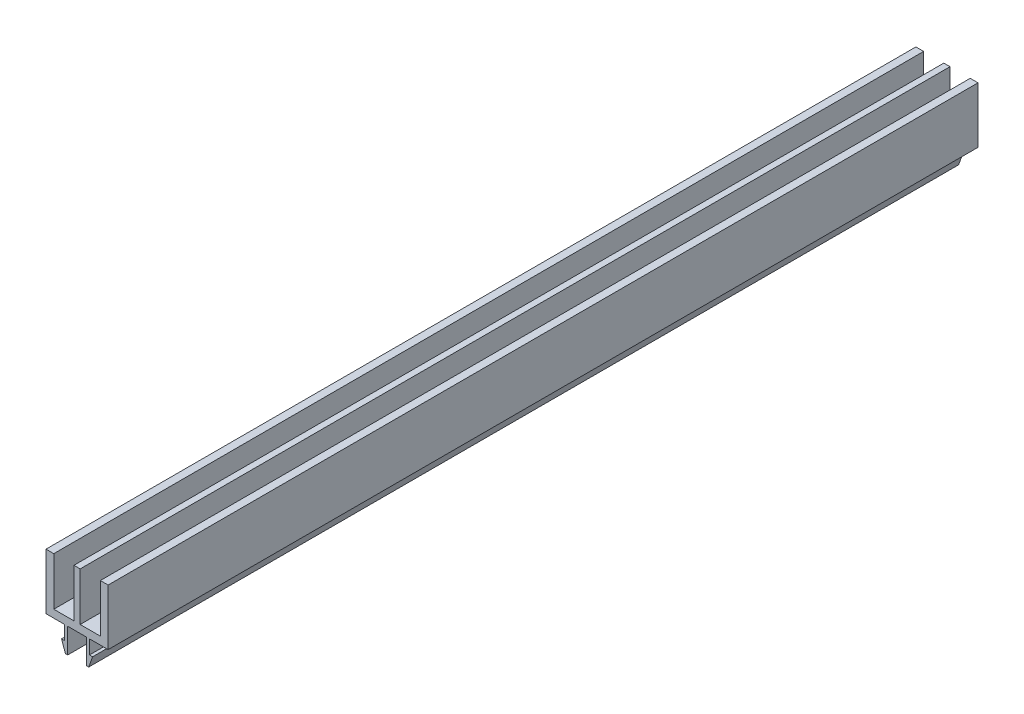
ISO-10303-21;
HEADER;
FILE_DESCRIPTION(('STEP AP214'),'2;1');
FILE_NAME('part.step','',(''),(''),'','','');
FILE_SCHEMA(('AUTOMOTIVE_DESIGN { 1 0 10303 214 1 1 1 1 }'));
ENDSEC;
DATA;
#1=APPLICATION_CONTEXT('core data for automotive mechanical design processes');
#2=APPLICATION_PROTOCOL_DEFINITION('international standard','automotive_design',2000,#1);
#3=PRODUCT_CONTEXT('',#1,'mechanical');
#4=PRODUCT('Part','Part','',(#3));
#5=PRODUCT_RELATED_PRODUCT_CATEGORY('part','',(#4));
#6=PRODUCT_DEFINITION_FORMATION('','',#4);
#7=PRODUCT_DEFINITION_CONTEXT('part definition',#1,'design');
#8=PRODUCT_DEFINITION('design','',#6,#7);
#9=PRODUCT_DEFINITION_SHAPE('','',#8);
#10=(LENGTH_UNIT() NAMED_UNIT(*) SI_UNIT(.MILLI.,.METRE.));
#11=(NAMED_UNIT(*) PLANE_ANGLE_UNIT() SI_UNIT($,.RADIAN.));
#12=(NAMED_UNIT(*) SI_UNIT($,.STERADIAN.) SOLID_ANGLE_UNIT());
#13=UNCERTAINTY_MEASURE_WITH_UNIT(LENGTH_MEASURE(1.E-05),#10,'distance_accuracy_value','');
#14=(GEOMETRIC_REPRESENTATION_CONTEXT(3) GLOBAL_UNCERTAINTY_ASSIGNED_CONTEXT((#13)) GLOBAL_UNIT_ASSIGNED_CONTEXT((#10,
#11,#12)) REPRESENTATION_CONTEXT('',''));
#15=CARTESIAN_POINT('',(0.,0.,0.));
#16=DIRECTION('',(0.,0.,1.));
#17=DIRECTION('',(1.,0.,0.));
#18=AXIS2_PLACEMENT_3D('',#15,#16,#17);
#19=CARTESIAN_POINT('',(-1.,17.9999999975,-230.));
#20=DIRECTION('',(-1.,0.,0.));
#21=DIRECTION('',(0.,-1.,0.));
#22=AXIS2_PLACEMENT_3D('',#19,#20,#21);
#23=PLANE('',#22);
#24=DIRECTION('',(0.,-1.,0.));
#25=VECTOR('',#24,1.);
#26=CARTESIAN_POINT('',(-1.,17.9999999975,50.));
#27=LINE('',#26,#25);
#28=CARTESIAN_POINT('',(-1.,17.9999999975,50.));
#29=VERTEX_POINT('',#28);
#30=CARTESIAN_POINT('',(-1.,2.4999999995,50.));
#31=VERTEX_POINT('',#30);
#32=EDGE_CURVE('E226',#29,#31,#27,.T.);
#33=ORIENTED_EDGE('',*,*,#32,.F.);
#34=DIRECTION('',(0.,0.,1.));
#35=VECTOR('',#34,1.);
#36=CARTESIAN_POINT('',(-1.,17.9999999975,-230.));
#37=LINE('',#36,#35);
#38=CARTESIAN_POINT('',(-1.,17.9999999975,-230.));
#39=VERTEX_POINT('',#38);
#40=EDGE_CURVE('E11',#39,#29,#37,.T.);
#41=ORIENTED_EDGE('',*,*,#40,.F.);
#42=DIRECTION('',(0.,-1.,0.));
#43=VECTOR('',#42,1.);
#44=CARTESIAN_POINT('',(-1.,17.9999999975,-230.));
#45=LINE('',#44,#43);
#46=CARTESIAN_POINT('',(-1.,2.4999999995,-230.));
#47=VERTEX_POINT('',#46);
#48=EDGE_CURVE('E294',#39,#47,#45,.T.);
#49=ORIENTED_EDGE('',*,*,#48,.T.);
#50=DIRECTION('',(0.,0.,1.));
#51=VECTOR('',#50,1.);
#52=CARTESIAN_POINT('',(-1.,2.4999999995,-230.));
#53=LINE('',#52,#51);
#54=EDGE_CURVE('E36',#47,#31,#53,.T.);
#55=ORIENTED_EDGE('',*,*,#54,.T.);
#56=EDGE_LOOP('',(#33,#41,#49,#55));
#57=FACE_BOUND('',#56,.T.);
#58=ADVANCED_FACE('F33',(#57),#23,.T.);
#59=CARTESIAN_POINT('',(0.999999999999998,17.9999999975,-230.));
#60=DIRECTION('',(0.,1.,0.));
#61=DIRECTION('',(0.,0.,1.));
#62=AXIS2_PLACEMENT_3D('',#59,#60,#61);
#63=PLANE('',#62);
#64=DIRECTION('',(-1.,0.,0.));
#65=VECTOR('',#64,1.);
#66=CARTESIAN_POINT('',(0.999999999999998,17.9999999975,50.));
#67=LINE('',#66,#65);
#68=CARTESIAN_POINT('',(0.999999999999998,17.9999999975,50.));
#69=VERTEX_POINT('',#68);
#70=EDGE_CURVE('E292',#69,#29,#67,.T.);
#71=ORIENTED_EDGE('',*,*,#70,.F.);
#72=DIRECTION('',(0.,0.,1.));
#73=VECTOR('',#72,1.);
#74=CARTESIAN_POINT('',(0.999999999999998,17.9999999975,-230.));
#75=LINE('',#74,#73);
#76=CARTESIAN_POINT('',(0.999999999999998,17.9999999975,-230.));
#77=VERTEX_POINT('',#76);
#78=EDGE_CURVE('E42',#77,#69,#75,.T.);
#79=ORIENTED_EDGE('',*,*,#78,.F.);
#80=DIRECTION('',(-1.,0.,0.));
#81=VECTOR('',#80,1.);
#82=CARTESIAN_POINT('',(0.999999999999998,17.9999999975,-230.));
#83=LINE('',#82,#81);
#84=EDGE_CURVE('E216',#77,#39,#83,.T.);
#85=ORIENTED_EDGE('',*,*,#84,.T.);
#86=ORIENTED_EDGE('',*,*,#40,.T.);
#87=EDGE_LOOP('',(#71,#79,#85,#86));
#88=FACE_BOUND('',#87,.T.);
#89=ADVANCED_FACE('F338',(#88),#63,.T.);
#90=CARTESIAN_POINT('',(0.999999999999998,2.4999999995,-230.));
#91=DIRECTION('',(1.,0.,0.));
#92=DIRECTION('',(0.,0.,-1.));
#93=AXIS2_PLACEMENT_3D('',#90,#91,#92);
#94=PLANE('',#93);
#95=DIRECTION('',(0.,1.,0.));
#96=VECTOR('',#95,1.);
#97=CARTESIAN_POINT('',(0.999999999999998,2.4999999995,50.));
#98=LINE('',#97,#96);
#99=CARTESIAN_POINT('',(0.999999999999998,2.4999999995,50.));
#100=VERTEX_POINT('',#99);
#101=EDGE_CURVE('E203',#100,#69,#98,.T.);
#102=ORIENTED_EDGE('',*,*,#101,.F.);
#103=DIRECTION('',(0.,0.,1.));
#104=VECTOR('',#103,1.);
#105=CARTESIAN_POINT('',(0.999999999999998,2.4999999995,-230.));
#106=LINE('',#105,#104);
#107=CARTESIAN_POINT('',(0.999999999999998,2.4999999995,-230.));
#108=VERTEX_POINT('',#107);
#109=EDGE_CURVE('E198',#108,#100,#106,.T.);
#110=ORIENTED_EDGE('',*,*,#109,.F.);
#111=DIRECTION('',(0.,1.,0.));
#112=VECTOR('',#111,1.);
#113=CARTESIAN_POINT('',(0.999999999999998,2.4999999995,-230.));
#114=LINE('',#113,#112);
#115=EDGE_CURVE('E201',#108,#77,#114,.T.);
#116=ORIENTED_EDGE('',*,*,#115,.T.);
#117=ORIENTED_EDGE('',*,*,#78,.T.);
#118=EDGE_LOOP('',(#102,#110,#116,#117));
#119=FACE_BOUND('',#118,.T.);
#120=ADVANCED_FACE('F200',(#119),#94,.T.);
#121=CARTESIAN_POINT('',(7.5,2.4999999995,-230.));
#122=DIRECTION('',(0.,1.,0.));
#123=DIRECTION('',(-1.,0.,0.));
#124=AXIS2_PLACEMENT_3D('',#121,#122,#123);
#125=PLANE('',#124);
#126=DIRECTION('',(-1.,0.,0.));
#127=VECTOR('',#126,1.);
#128=CARTESIAN_POINT('',(7.5,2.4999999995,50.));
#129=LINE('',#128,#127);
#130=CARTESIAN_POINT('',(7.5,2.4999999995,50.));
#131=VERTEX_POINT('',#130);
#132=EDGE_CURVE('E289',#131,#100,#129,.T.);
#133=ORIENTED_EDGE('',*,*,#132,.F.);
#134=DIRECTION('',(0.,0.,1.));
#135=VECTOR('',#134,1.);
#136=CARTESIAN_POINT('',(7.5,2.4999999995,-230.));
#137=LINE('',#136,#135);
#138=CARTESIAN_POINT('',(7.5,2.4999999995,-230.));
#139=VERTEX_POINT('',#138);
#140=EDGE_CURVE('E208',#139,#131,#137,.T.);
#141=ORIENTED_EDGE('',*,*,#140,.F.);
#142=DIRECTION('',(-1.,0.,0.));
#143=VECTOR('',#142,1.);
#144=CARTESIAN_POINT('',(7.5,2.4999999995,-230.));
#145=LINE('',#144,#143);
#146=EDGE_CURVE('E214',#139,#108,#145,.T.);
#147=ORIENTED_EDGE('',*,*,#146,.T.);
#148=ORIENTED_EDGE('',*,*,#109,.T.);
#149=EDGE_LOOP('',(#133,#141,#147,#148));
#150=FACE_BOUND('',#149,.T.);
#151=ADVANCED_FACE('F218',(#150),#125,.T.);
#152=CARTESIAN_POINT('',(7.5,17.9999999975,-230.));
#153=DIRECTION('',(-1.,0.,0.));
#154=DIRECTION('',(0.,-1.,0.));
#155=AXIS2_PLACEMENT_3D('',#152,#153,#154);
#156=PLANE('',#155);
#157=DIRECTION('',(0.,-1.,0.));
#158=VECTOR('',#157,1.);
#159=CARTESIAN_POINT('',(7.5,17.9999999975,50.));
#160=LINE('',#159,#158);
#161=CARTESIAN_POINT('',(7.5,17.9999999975,50.));
#162=VERTEX_POINT('',#161);
#163=EDGE_CURVE('E286',#162,#131,#160,.T.);
#164=ORIENTED_EDGE('',*,*,#163,.F.);
#165=DIRECTION('',(0.,0.,1.));
#166=VECTOR('',#165,1.);
#167=CARTESIAN_POINT('',(7.5,17.9999999975,-230.));
#168=LINE('',#167,#166);
#169=CARTESIAN_POINT('',(7.5,17.9999999975,-230.));
#170=VERTEX_POINT('',#169);
#171=EDGE_CURVE('E298',#170,#162,#168,.T.);
#172=ORIENTED_EDGE('',*,*,#171,.F.);
#173=DIRECTION('',(0.,-1.,0.));
#174=VECTOR('',#173,1.);
#175=CARTESIAN_POINT('',(7.5,17.9999999975,-230.));
#176=LINE('',#175,#174);
#177=EDGE_CURVE('E219',#170,#139,#176,.T.);
#178=ORIENTED_EDGE('',*,*,#177,.T.);
#179=ORIENTED_EDGE('',*,*,#140,.T.);
#180=EDGE_LOOP('',(#164,#172,#178,#179));
#181=FACE_BOUND('',#180,.T.);
#182=ADVANCED_FACE('F351',(#181),#156,.T.);
#183=CARTESIAN_POINT('',(10.,17.9999999975,-230.));
#184=DIRECTION('',(0.,1.,0.));
#185=DIRECTION('',(0.,0.,1.));
#186=AXIS2_PLACEMENT_3D('',#183,#184,#185);
#187=PLANE('',#186);
#188=DIRECTION('',(-1.,0.,0.));
#189=VECTOR('',#188,1.);
#190=CARTESIAN_POINT('',(10.,17.9999999975,50.));
#191=LINE('',#190,#189);
#192=CARTESIAN_POINT('',(10.,17.9999999975,50.));
#193=VERTEX_POINT('',#192);
#194=EDGE_CURVE('E283',#193,#162,#191,.T.);
#195=ORIENTED_EDGE('',*,*,#194,.F.);
#196=DIRECTION('',(0.,0.,1.));
#197=VECTOR('',#196,1.);
#198=CARTESIAN_POINT('',(10.,17.9999999975,-230.));
#199=LINE('',#198,#197);
#200=CARTESIAN_POINT('',(10.,17.9999999975,-230.));
#201=VERTEX_POINT('',#200);
#202=EDGE_CURVE('E300',#201,#193,#199,.T.);
#203=ORIENTED_EDGE('',*,*,#202,.F.);
#204=DIRECTION('',(-1.,0.,0.));
#205=VECTOR('',#204,1.);
#206=CARTESIAN_POINT('',(10.,17.9999999975,-230.));
#207=LINE('',#206,#205);
#208=EDGE_CURVE('E221',#201,#170,#207,.T.);
#209=ORIENTED_EDGE('',*,*,#208,.T.);
#210=ORIENTED_EDGE('',*,*,#171,.T.);
#211=EDGE_LOOP('',(#195,#203,#209,#210));
#212=FACE_BOUND('',#211,.T.);
#213=ADVANCED_FACE('F354',(#212),#187,.T.);
#214=CARTESIAN_POINT('',(10.,-4.99999828349541E-10,-230.));
#215=DIRECTION('',(1.,0.,0.));
#216=DIRECTION('',(0.,0.,-1.));
#217=AXIS2_PLACEMENT_3D('',#214,#215,#216);
#218=PLANE('',#217);
#219=DIRECTION('',(0.,1.,0.));
#220=VECTOR('',#219,1.);
#221=CARTESIAN_POINT('',(10.,-4.99999828349541E-10,50.));
#222=LINE('',#221,#220);
#223=CARTESIAN_POINT('',(10.,-4.99999828349541E-10,50.));
#224=VERTEX_POINT('',#223);
#225=EDGE_CURVE('E280',#224,#193,#222,.T.);
#226=ORIENTED_EDGE('',*,*,#225,.F.);
#227=DIRECTION('',(0.,0.,1.));
#228=VECTOR('',#227,1.);
#229=CARTESIAN_POINT('',(10.,-4.99999828349541E-10,-230.));
#230=LINE('',#229,#228);
#231=CARTESIAN_POINT('',(10.,-4.99999828349541E-10,-230.));
#232=VERTEX_POINT('',#231);
#233=EDGE_CURVE('E302',#232,#224,#230,.T.);
#234=ORIENTED_EDGE('',*,*,#233,.F.);
#235=DIRECTION('',(0.,1.,0.));
#236=VECTOR('',#235,1.);
#237=CARTESIAN_POINT('',(10.,-4.99999828349541E-10,-230.));
#238=LINE('',#237,#236);
#239=EDGE_CURVE('E644',#232,#201,#238,.T.);
#240=ORIENTED_EDGE('',*,*,#239,.T.);
#241=ORIENTED_EDGE('',*,*,#202,.T.);
#242=EDGE_LOOP('',(#226,#234,#240,#241));
#243=FACE_BOUND('',#242,.T.);
#244=ADVANCED_FACE('F358',(#243),#218,.T.);
#245=CARTESIAN_POINT('',(4.,-4.99999998002099E-10,-230.));
#246=DIRECTION('',(0.,-1.,0.));
#247=DIRECTION('',(1.,0.,0.));
#248=AXIS2_PLACEMENT_3D('',#245,#246,#247);
#249=PLANE('',#248);
#250=DIRECTION('',(1.,0.,0.));
#251=VECTOR('',#250,1.);
#252=CARTESIAN_POINT('',(4.,-4.99999998002099E-10,50.));
#253=LINE('',#252,#251);
#254=CARTESIAN_POINT('',(4.,-4.99999998002099E-10,50.));
#255=VERTEX_POINT('',#254);
#256=EDGE_CURVE('E277',#255,#224,#253,.T.);
#257=ORIENTED_EDGE('',*,*,#256,.F.);
#258=DIRECTION('',(0.,0.,1.));
#259=VECTOR('',#258,1.);
#260=CARTESIAN_POINT('',(4.,-4.99999998002099E-10,-230.));
#261=LINE('',#260,#259);
#262=CARTESIAN_POINT('',(4.,-4.99999998002099E-10,-230.));
#263=VERTEX_POINT('',#262);
#264=EDGE_CURVE('E304',#263,#255,#261,.T.);
#265=ORIENTED_EDGE('',*,*,#264,.F.);
#266=DIRECTION('',(1.,0.,0.));
#267=VECTOR('',#266,1.);
#268=CARTESIAN_POINT('',(4.,-4.99999998002099E-10,-230.));
#269=LINE('',#268,#267);
#270=EDGE_CURVE('E648',#263,#232,#269,.T.);
#271=ORIENTED_EDGE('',*,*,#270,.T.);
#272=ORIENTED_EDGE('',*,*,#233,.T.);
#273=EDGE_LOOP('',(#257,#265,#271,#272));
#274=FACE_BOUND('',#273,.T.);
#275=ADVANCED_FACE('F362',(#274),#249,.T.);
#276=CARTESIAN_POINT('',(4.,-4.5,-230.));
#277=DIRECTION('',(1.,0.,0.));
#278=DIRECTION('',(0.,0.,-1.));
#279=AXIS2_PLACEMENT_3D('',#276,#277,#278);
#280=PLANE('',#279);
#281=DIRECTION('',(0.,1.,0.));
#282=VECTOR('',#281,1.);
#283=CARTESIAN_POINT('',(4.,-4.5,50.));
#284=LINE('',#283,#282);
#285=CARTESIAN_POINT('',(4.,-4.5,50.));
#286=VERTEX_POINT('',#285);
#287=EDGE_CURVE('E274',#286,#255,#284,.T.);
#288=ORIENTED_EDGE('',*,*,#287,.F.);
#289=DIRECTION('',(0.,0.,1.));
#290=VECTOR('',#289,1.);
#291=CARTESIAN_POINT('',(4.,-4.5,-230.));
#292=LINE('',#291,#290);
#293=CARTESIAN_POINT('',(4.,-4.5,-230.));
#294=VERTEX_POINT('',#293);
#295=EDGE_CURVE('E306',#294,#286,#292,.T.);
#296=ORIENTED_EDGE('',*,*,#295,.F.);
#297=DIRECTION('',(0.,1.,0.));
#298=VECTOR('',#297,1.);
#299=CARTESIAN_POINT('',(4.,-4.5,-230.));
#300=LINE('',#299,#298);
#301=EDGE_CURVE('E637',#294,#263,#300,.T.);
#302=ORIENTED_EDGE('',*,*,#301,.T.);
#303=ORIENTED_EDGE('',*,*,#264,.T.);
#304=EDGE_LOOP('',(#288,#296,#302,#303));
#305=FACE_BOUND('',#304,.T.);
#306=ADVANCED_FACE('F366',(#305),#280,.T.);
#307=CARTESIAN_POINT('',(5.,-4.5,-230.));
#308=DIRECTION('',(0.,1.,0.));
#309=DIRECTION('',(0.,0.,1.));
#310=AXIS2_PLACEMENT_3D('',#307,#308,#309);
#311=PLANE('',#310);
#312=DIRECTION('',(-1.,0.,0.));
#313=VECTOR('',#312,1.);
#314=CARTESIAN_POINT('',(5.,-4.5,50.));
#315=LINE('',#314,#313);
#316=CARTESIAN_POINT('',(5.,-4.5,50.));
#317=VERTEX_POINT('',#316);
#318=EDGE_CURVE('E271',#317,#286,#315,.T.);
#319=ORIENTED_EDGE('',*,*,#318,.F.);
#320=DIRECTION('',(0.,0.,1.));
#321=VECTOR('',#320,1.);
#322=CARTESIAN_POINT('',(5.,-4.5,-230.));
#323=LINE('',#322,#321);
#324=CARTESIAN_POINT('',(5.,-4.5,-230.));
#325=VERTEX_POINT('',#324);
#326=EDGE_CURVE('E308',#325,#317,#323,.T.);
#327=ORIENTED_EDGE('',*,*,#326,.F.);
#328=DIRECTION('',(-1.,0.,0.));
#329=VECTOR('',#328,1.);
#330=CARTESIAN_POINT('',(5.,-4.5,-230.));
#331=LINE('',#330,#329);
#332=EDGE_CURVE('E633',#325,#294,#331,.T.);
#333=ORIENTED_EDGE('',*,*,#332,.T.);
#334=ORIENTED_EDGE('',*,*,#295,.T.);
#335=EDGE_LOOP('',(#319,#327,#333,#334));
#336=FACE_BOUND('',#335,.T.);
#337=ADVANCED_FACE('F370',(#336),#311,.T.);
#338=CARTESIAN_POINT('',(3.75,-8.,-230.));
#339=DIRECTION('',(0.941741911594837,-0.336336396998156,0.));
#340=DIRECTION('',(0.336336396998156,0.941741911594838,0.));
#341=AXIS2_PLACEMENT_3D('',#338,#339,#340);
#342=PLANE('',#341);
#343=DIRECTION('',(0.336336396998157,0.941741911594837,0.));
#344=VECTOR('',#343,1.);
#345=CARTESIAN_POINT('',(3.75,-8.,50.));
#346=LINE('',#345,#344);
#347=CARTESIAN_POINT('',(3.75,-8.,50.));
#348=VERTEX_POINT('',#347);
#349=EDGE_CURVE('E268',#348,#317,#346,.T.);
#350=ORIENTED_EDGE('',*,*,#349,.F.);
#351=DIRECTION('',(0.,0.,1.));
#352=VECTOR('',#351,1.);
#353=CARTESIAN_POINT('',(3.75,-8.,-230.));
#354=LINE('',#353,#352);
#355=CARTESIAN_POINT('',(3.75,-8.,-230.));
#356=VERTEX_POINT('',#355);
#357=EDGE_CURVE('E310',#356,#348,#354,.T.);
#358=ORIENTED_EDGE('',*,*,#357,.F.);
#359=DIRECTION('',(0.336336396998157,0.941741911594837,0.));
#360=VECTOR('',#359,1.);
#361=CARTESIAN_POINT('',(3.75,-8.,-230.));
#362=LINE('',#361,#360);
#363=EDGE_CURVE('E654',#356,#325,#362,.T.);
#364=ORIENTED_EDGE('',*,*,#363,.T.);
#365=ORIENTED_EDGE('',*,*,#326,.T.);
#366=EDGE_LOOP('',(#350,#358,#364,#365));
#367=FACE_BOUND('',#366,.T.);
#368=ADVANCED_FACE('F374',(#367),#342,.T.);
#369=CARTESIAN_POINT('',(3.,-8.,-230.));
#370=DIRECTION('',(0.,-1.,0.));
#371=DIRECTION('',(0.,0.,-1.));
#372=AXIS2_PLACEMENT_3D('',#369,#370,#371);
#373=PLANE('',#372);
#374=DIRECTION('',(1.,0.,0.));
#375=VECTOR('',#374,1.);
#376=CARTESIAN_POINT('',(3.,-8.,50.));
#377=LINE('',#376,#375);
#378=CARTESIAN_POINT('',(3.,-8.,50.));
#379=VERTEX_POINT('',#378);
#380=EDGE_CURVE('E265',#379,#348,#377,.T.);
#381=ORIENTED_EDGE('',*,*,#380,.F.);
#382=DIRECTION('',(0.,0.,1.));
#383=VECTOR('',#382,1.);
#384=CARTESIAN_POINT('',(3.,-8.,-230.));
#385=LINE('',#384,#383);
#386=CARTESIAN_POINT('',(3.,-8.,-230.));
#387=VERTEX_POINT('',#386);
#388=EDGE_CURVE('E312',#387,#379,#385,.T.);
#389=ORIENTED_EDGE('',*,*,#388,.F.);
#390=DIRECTION('',(1.,0.,0.));
#391=VECTOR('',#390,1.);
#392=CARTESIAN_POINT('',(3.,-8.,-230.));
#393=LINE('',#392,#391);
#394=EDGE_CURVE('E626',#387,#356,#393,.T.);
#395=ORIENTED_EDGE('',*,*,#394,.T.);
#396=ORIENTED_EDGE('',*,*,#357,.T.);
#397=EDGE_LOOP('',(#381,#389,#395,#396));
#398=FACE_BOUND('',#397,.T.);
#399=ADVANCED_FACE('F378',(#398),#373,.T.);
#400=CARTESIAN_POINT('',(3.,-4.9999985194348E-10,-230.));
#401=DIRECTION('',(-1.,0.,0.));
#402=DIRECTION('',(0.,0.,1.));
#403=AXIS2_PLACEMENT_3D('',#400,#401,#402);
#404=PLANE('',#403);
#405=DIRECTION('',(0.,-1.,0.));
#406=VECTOR('',#405,1.);
#407=CARTESIAN_POINT('',(3.,-4.9999985194348E-10,50.));
#408=LINE('',#407,#406);
#409=CARTESIAN_POINT('',(3.,-4.9999985194348E-10,50.));
#410=VERTEX_POINT('',#409);
#411=EDGE_CURVE('E262',#410,#379,#408,.T.);
#412=ORIENTED_EDGE('',*,*,#411,.F.);
#413=DIRECTION('',(0.,0.,1.));
#414=VECTOR('',#413,1.);
#415=CARTESIAN_POINT('',(3.,-4.9999985194348E-10,-230.));
#416=LINE('',#415,#414);
#417=CARTESIAN_POINT('',(3.,-4.9999985194348E-10,-230.));
#418=VERTEX_POINT('',#417);
#419=EDGE_CURVE('E314',#418,#410,#416,.T.);
#420=ORIENTED_EDGE('',*,*,#419,.F.);
#421=DIRECTION('',(0.,-1.,0.));
#422=VECTOR('',#421,1.);
#423=CARTESIAN_POINT('',(3.,-4.9999985194348E-10,-230.));
#424=LINE('',#423,#422);
#425=EDGE_CURVE('E622',#418,#387,#424,.T.);
#426=ORIENTED_EDGE('',*,*,#425,.T.);
#427=ORIENTED_EDGE('',*,*,#388,.T.);
#428=EDGE_LOOP('',(#412,#420,#426,#427));
#429=FACE_BOUND('',#428,.T.);
#430=ADVANCED_FACE('F382',(#429),#404,.T.);
#431=CARTESIAN_POINT('',(-3.,-4.99999455901012E-10,-230.));
#432=DIRECTION('',(0.,-1.,0.));
#433=DIRECTION('',(1.,0.,0.));
#434=AXIS2_PLACEMENT_3D('',#431,#432,#433);
#435=PLANE('',#434);
#436=DIRECTION('',(1.,0.,0.));
#437=VECTOR('',#436,1.);
#438=CARTESIAN_POINT('',(-3.,-4.99999455901012E-10,50.));
#439=LINE('',#438,#437);
#440=CARTESIAN_POINT('',(-3.,-4.99999455901012E-10,50.));
#441=VERTEX_POINT('',#440);
#442=EDGE_CURVE('E259',#441,#410,#439,.T.);
#443=ORIENTED_EDGE('',*,*,#442,.F.);
#444=DIRECTION('',(0.,0.,1.));
#445=VECTOR('',#444,1.);
#446=CARTESIAN_POINT('',(-3.,-4.99999455901012E-10,-230.));
#447=LINE('',#446,#445);
#448=CARTESIAN_POINT('',(-3.,-4.99999455901012E-10,-230.));
#449=VERTEX_POINT('',#448);
#450=EDGE_CURVE('E316',#449,#441,#447,.T.);
#451=ORIENTED_EDGE('',*,*,#450,.F.);
#452=DIRECTION('',(1.,0.,0.));
#453=VECTOR('',#452,1.);
#454=CARTESIAN_POINT('',(-3.,-4.99999455901012E-10,-230.));
#455=LINE('',#454,#453);
#456=EDGE_CURVE('E658',#449,#418,#455,.T.);
#457=ORIENTED_EDGE('',*,*,#456,.T.);
#458=ORIENTED_EDGE('',*,*,#419,.T.);
#459=EDGE_LOOP('',(#443,#451,#457,#458));
#460=FACE_BOUND('',#459,.T.);
#461=ADVANCED_FACE('F386',(#460),#435,.T.);
#462=CARTESIAN_POINT('',(-3.,-8.,-230.));
#463=DIRECTION('',(1.,0.,0.));
#464=DIRECTION('',(0.,0.,-1.));
#465=AXIS2_PLACEMENT_3D('',#462,#463,#464);
#466=PLANE('',#465);
#467=DIRECTION('',(0.,1.,0.));
#468=VECTOR('',#467,1.);
#469=CARTESIAN_POINT('',(-3.,-8.,50.));
#470=LINE('',#469,#468);
#471=CARTESIAN_POINT('',(-3.,-8.,50.));
#472=VERTEX_POINT('',#471);
#473=EDGE_CURVE('E256',#472,#441,#470,.T.);
#474=ORIENTED_EDGE('',*,*,#473,.F.);
#475=DIRECTION('',(0.,0.,1.));
#476=VECTOR('',#475,1.);
#477=CARTESIAN_POINT('',(-3.,-8.,-230.));
#478=LINE('',#477,#476);
#479=CARTESIAN_POINT('',(-3.,-8.,-230.));
#480=VERTEX_POINT('',#479);
#481=EDGE_CURVE('E318',#480,#472,#478,.T.);
#482=ORIENTED_EDGE('',*,*,#481,.F.);
#483=DIRECTION('',(0.,1.,0.));
#484=VECTOR('',#483,1.);
#485=CARTESIAN_POINT('',(-3.,-8.,-230.));
#486=LINE('',#485,#484);
#487=EDGE_CURVE('E615',#480,#449,#486,.T.);
#488=ORIENTED_EDGE('',*,*,#487,.T.);
#489=ORIENTED_EDGE('',*,*,#450,.T.);
#490=EDGE_LOOP('',(#474,#482,#488,#489));
#491=FACE_BOUND('',#490,.T.);
#492=ADVANCED_FACE('F390',(#491),#466,.T.);
#493=CARTESIAN_POINT('',(-3.75,-8.,-230.));
#494=DIRECTION('',(0.,-1.,0.));
#495=DIRECTION('',(0.,0.,-1.));
#496=AXIS2_PLACEMENT_3D('',#493,#494,#495);
#497=PLANE('',#496);
#498=DIRECTION('',(1.,0.,0.));
#499=VECTOR('',#498,1.);
#500=CARTESIAN_POINT('',(-3.75,-8.,50.));
#501=LINE('',#500,#499);
#502=CARTESIAN_POINT('',(-3.75,-8.,50.));
#503=VERTEX_POINT('',#502);
#504=EDGE_CURVE('E253',#503,#472,#501,.T.);
#505=ORIENTED_EDGE('',*,*,#504,.F.);
#506=DIRECTION('',(0.,0.,1.));
#507=VECTOR('',#506,1.);
#508=CARTESIAN_POINT('',(-3.75,-8.,-230.));
#509=LINE('',#508,#507);
#510=CARTESIAN_POINT('',(-3.75,-8.,-230.));
#511=VERTEX_POINT('',#510);
#512=EDGE_CURVE('E320',#511,#503,#509,.T.);
#513=ORIENTED_EDGE('',*,*,#512,.F.);
#514=DIRECTION('',(1.,0.,0.));
#515=VECTOR('',#514,1.);
#516=CARTESIAN_POINT('',(-3.75,-8.,-230.));
#517=LINE('',#516,#515);
#518=EDGE_CURVE('E611',#511,#480,#517,.T.);
#519=ORIENTED_EDGE('',*,*,#518,.T.);
#520=ORIENTED_EDGE('',*,*,#481,.T.);
#521=EDGE_LOOP('',(#505,#513,#519,#520));
#522=FACE_BOUND('',#521,.T.);
#523=ADVANCED_FACE('F394',(#522),#497,.T.);
#524=CARTESIAN_POINT('',(-5.,-4.5,-230.));
#525=DIRECTION('',(-0.941741911594837,-0.336336396998156,0.));
#526=DIRECTION('',(0.336336396998156,-0.941741911594838,0.));
#527=AXIS2_PLACEMENT_3D('',#524,#525,#526);
#528=PLANE('',#527);
#529=DIRECTION('',(0.336336396998156,-0.941741911594837,0.));
#530=VECTOR('',#529,1.);
#531=CARTESIAN_POINT('',(-5.,-4.5,50.));
#532=LINE('',#531,#530);
#533=CARTESIAN_POINT('',(-5.,-4.5,50.));
#534=VERTEX_POINT('',#533);
#535=EDGE_CURVE('E250',#534,#503,#532,.T.);
#536=ORIENTED_EDGE('',*,*,#535,.F.);
#537=DIRECTION('',(0.,0.,1.));
#538=VECTOR('',#537,1.);
#539=CARTESIAN_POINT('',(-5.,-4.5,-230.));
#540=LINE('',#539,#538);
#541=CARTESIAN_POINT('',(-5.,-4.5,-230.));
#542=VERTEX_POINT('',#541);
#543=EDGE_CURVE('E322',#542,#534,#540,.T.);
#544=ORIENTED_EDGE('',*,*,#543,.F.);
#545=DIRECTION('',(0.336336396998156,-0.941741911594837,0.));
#546=VECTOR('',#545,1.);
#547=CARTESIAN_POINT('',(-5.,-4.5,-230.));
#548=LINE('',#547,#546);
#549=EDGE_CURVE('E662',#542,#511,#548,.T.);
#550=ORIENTED_EDGE('',*,*,#549,.T.);
#551=ORIENTED_EDGE('',*,*,#512,.T.);
#552=EDGE_LOOP('',(#536,#544,#550,#551));
#553=FACE_BOUND('',#552,.T.);
#554=ADVANCED_FACE('F398',(#553),#528,.T.);
#555=CARTESIAN_POINT('',(-4.,-4.5,-230.));
#556=DIRECTION('',(0.,1.,0.));
#557=DIRECTION('',(0.,0.,1.));
#558=AXIS2_PLACEMENT_3D('',#555,#556,#557);
#559=PLANE('',#558);
#560=DIRECTION('',(-1.,0.,0.));
#561=VECTOR('',#560,1.);
#562=CARTESIAN_POINT('',(-4.,-4.5,50.));
#563=LINE('',#562,#561);
#564=CARTESIAN_POINT('',(-4.,-4.5,50.));
#565=VERTEX_POINT('',#564);
#566=EDGE_CURVE('E247',#565,#534,#563,.T.);
#567=ORIENTED_EDGE('',*,*,#566,.F.);
#568=DIRECTION('',(0.,0.,1.));
#569=VECTOR('',#568,1.);
#570=CARTESIAN_POINT('',(-4.,-4.5,-230.));
#571=LINE('',#570,#569);
#572=CARTESIAN_POINT('',(-4.,-4.5,-230.));
#573=VERTEX_POINT('',#572);
#574=EDGE_CURVE('E324',#573,#565,#571,.T.);
#575=ORIENTED_EDGE('',*,*,#574,.F.);
#576=DIRECTION('',(-1.,0.,0.));
#577=VECTOR('',#576,1.);
#578=CARTESIAN_POINT('',(-4.,-4.5,-230.));
#579=LINE('',#578,#577);
#580=EDGE_CURVE('E604',#573,#542,#579,.T.);
#581=ORIENTED_EDGE('',*,*,#580,.T.);
#582=ORIENTED_EDGE('',*,*,#543,.T.);
#583=EDGE_LOOP('',(#567,#575,#581,#582));
#584=FACE_BOUND('',#583,.T.);
#585=ADVANCED_FACE('F402',(#584),#559,.T.);
#586=CARTESIAN_POINT('',(-4.,-4.9999985194348E-10,-230.));
#587=DIRECTION('',(-1.,0.,0.));
#588=DIRECTION('',(0.,0.,1.));
#589=AXIS2_PLACEMENT_3D('',#586,#587,#588);
#590=PLANE('',#589);
#591=DIRECTION('',(0.,-1.,0.));
#592=VECTOR('',#591,1.);
#593=CARTESIAN_POINT('',(-4.,-4.9999985194348E-10,50.));
#594=LINE('',#593,#592);
#595=CARTESIAN_POINT('',(-4.,-4.9999985194348E-10,50.));
#596=VERTEX_POINT('',#595);
#597=EDGE_CURVE('E244',#596,#565,#594,.T.);
#598=ORIENTED_EDGE('',*,*,#597,.F.);
#599=DIRECTION('',(0.,0.,1.));
#600=VECTOR('',#599,1.);
#601=CARTESIAN_POINT('',(-4.,-4.9999985194348E-10,-230.));
#602=LINE('',#601,#600);
#603=CARTESIAN_POINT('',(-4.,-4.9999985194348E-10,-230.));
#604=VERTEX_POINT('',#603);
#605=EDGE_CURVE('E326',#604,#596,#602,.T.);
#606=ORIENTED_EDGE('',*,*,#605,.F.);
#607=DIRECTION('',(0.,-1.,0.));
#608=VECTOR('',#607,1.);
#609=CARTESIAN_POINT('',(-4.,-4.9999985194348E-10,-230.));
#610=LINE('',#609,#608);
#611=EDGE_CURVE('E600',#604,#573,#610,.T.);
#612=ORIENTED_EDGE('',*,*,#611,.T.);
#613=ORIENTED_EDGE('',*,*,#574,.T.);
#614=EDGE_LOOP('',(#598,#606,#612,#613));
#615=FACE_BOUND('',#614,.T.);
#616=ADVANCED_FACE('F406',(#615),#590,.T.);
#617=CARTESIAN_POINT('',(-10.,-4.99999719929324E-10,-230.));
#618=DIRECTION('',(0.,-1.,0.));
#619=DIRECTION('',(1.,0.,0.));
#620=AXIS2_PLACEMENT_3D('',#617,#618,#619);
#621=PLANE('',#620);
#622=DIRECTION('',(1.,0.,0.));
#623=VECTOR('',#622,1.);
#624=CARTESIAN_POINT('',(-10.,-4.99999719929324E-10,50.));
#625=LINE('',#624,#623);
#626=CARTESIAN_POINT('',(-10.,-4.99999719929324E-10,50.));
#627=VERTEX_POINT('',#626);
#628=EDGE_CURVE('E241',#627,#596,#625,.T.);
#629=ORIENTED_EDGE('',*,*,#628,.F.);
#630=DIRECTION('',(0.,0.,1.));
#631=VECTOR('',#630,1.);
#632=CARTESIAN_POINT('',(-10.,-4.99999719929324E-10,-230.));
#633=LINE('',#632,#631);
#634=CARTESIAN_POINT('',(-10.,-4.99999719929324E-10,-230.));
#635=VERTEX_POINT('',#634);
#636=EDGE_CURVE('E328',#635,#627,#633,.T.);
#637=ORIENTED_EDGE('',*,*,#636,.F.);
#638=DIRECTION('',(1.,0.,0.));
#639=VECTOR('',#638,1.);
#640=CARTESIAN_POINT('',(-10.,-4.99999719929324E-10,-230.));
#641=LINE('',#640,#639);
#642=EDGE_CURVE('E666',#635,#604,#641,.T.);
#643=ORIENTED_EDGE('',*,*,#642,.T.);
#644=ORIENTED_EDGE('',*,*,#605,.T.);
#645=EDGE_LOOP('',(#629,#637,#643,#644));
#646=FACE_BOUND('',#645,.T.);
#647=ADVANCED_FACE('F410',(#646),#621,.T.);
#648=CARTESIAN_POINT('',(-10.,17.9999999975,-230.));
#649=DIRECTION('',(-1.,0.,0.));
#650=DIRECTION('',(0.,-1.,0.));
#651=AXIS2_PLACEMENT_3D('',#648,#649,#650);
#652=PLANE('',#651);
#653=DIRECTION('',(0.,-1.,0.));
#654=VECTOR('',#653,1.);
#655=CARTESIAN_POINT('',(-10.,17.9999999975,50.));
#656=LINE('',#655,#654);
#657=CARTESIAN_POINT('',(-10.,17.9999999975,50.));
#658=VERTEX_POINT('',#657);
#659=EDGE_CURVE('E238',#658,#627,#656,.T.);
#660=ORIENTED_EDGE('',*,*,#659,.F.);
#661=DIRECTION('',(0.,0.,1.));
#662=VECTOR('',#661,1.);
#663=CARTESIAN_POINT('',(-10.,17.9999999975,-230.));
#664=LINE('',#663,#662);
#665=CARTESIAN_POINT('',(-10.,17.9999999975,-230.));
#666=VERTEX_POINT('',#665);
#667=EDGE_CURVE('E330',#666,#658,#664,.T.);
#668=ORIENTED_EDGE('',*,*,#667,.F.);
#669=DIRECTION('',(0.,-1.,0.));
#670=VECTOR('',#669,1.);
#671=CARTESIAN_POINT('',(-10.,17.9999999975,-230.));
#672=LINE('',#671,#670);
#673=EDGE_CURVE('E593',#666,#635,#672,.T.);
#674=ORIENTED_EDGE('',*,*,#673,.T.);
#675=ORIENTED_EDGE('',*,*,#636,.T.);
#676=EDGE_LOOP('',(#660,#668,#674,#675));
#677=FACE_BOUND('',#676,.T.);
#678=ADVANCED_FACE('F414',(#677),#652,.T.);
#679=CARTESIAN_POINT('',(-7.5,17.9999999975,-230.));
#680=DIRECTION('',(0.,1.,0.));
#681=DIRECTION('',(0.,0.,1.));
#682=AXIS2_PLACEMENT_3D('',#679,#680,#681);
#683=PLANE('',#682);
#684=DIRECTION('',(-1.,0.,0.));
#685=VECTOR('',#684,1.);
#686=CARTESIAN_POINT('',(-7.5,17.9999999975,50.));
#687=LINE('',#686,#685);
#688=CARTESIAN_POINT('',(-7.5,17.9999999975,50.));
#689=VERTEX_POINT('',#688);
#690=EDGE_CURVE('E235',#689,#658,#687,.T.);
#691=ORIENTED_EDGE('',*,*,#690,.F.);
#692=DIRECTION('',(0.,0.,1.));
#693=VECTOR('',#692,1.);
#694=CARTESIAN_POINT('',(-7.5,17.9999999975,-230.));
#695=LINE('',#694,#693);
#696=CARTESIAN_POINT('',(-7.5,17.9999999975,-230.));
#697=VERTEX_POINT('',#696);
#698=EDGE_CURVE('E332',#697,#689,#695,.T.);
#699=ORIENTED_EDGE('',*,*,#698,.F.);
#700=DIRECTION('',(-1.,0.,0.));
#701=VECTOR('',#700,1.);
#702=CARTESIAN_POINT('',(-7.5,17.9999999975,-230.));
#703=LINE('',#702,#701);
#704=EDGE_CURVE('E589',#697,#666,#703,.T.);
#705=ORIENTED_EDGE('',*,*,#704,.T.);
#706=ORIENTED_EDGE('',*,*,#667,.T.);
#707=EDGE_LOOP('',(#691,#699,#705,#706));
#708=FACE_BOUND('',#707,.T.);
#709=ADVANCED_FACE('F418',(#708),#683,.T.);
#710=CARTESIAN_POINT('',(-7.5,2.4999999995,-230.));
#711=DIRECTION('',(1.,0.,0.));
#712=DIRECTION('',(0.,0.,-1.));
#713=AXIS2_PLACEMENT_3D('',#710,#711,#712);
#714=PLANE('',#713);
#715=DIRECTION('',(0.,1.,0.));
#716=VECTOR('',#715,1.);
#717=CARTESIAN_POINT('',(-7.5,2.4999999995,50.));
#718=LINE('',#717,#716);
#719=CARTESIAN_POINT('',(-7.5,2.4999999995,50.));
#720=VERTEX_POINT('',#719);
#721=EDGE_CURVE('E232',#720,#689,#718,.T.);
#722=ORIENTED_EDGE('',*,*,#721,.F.);
#723=DIRECTION('',(0.,0.,1.));
#724=VECTOR('',#723,1.);
#725=CARTESIAN_POINT('',(-7.5,2.4999999995,-230.));
#726=LINE('',#725,#724);
#727=CARTESIAN_POINT('',(-7.5,2.4999999995,-230.));
#728=VERTEX_POINT('',#727);
#729=EDGE_CURVE('E333',#728,#720,#726,.T.);
#730=ORIENTED_EDGE('',*,*,#729,.F.);
#731=DIRECTION('',(0.,1.,0.));
#732=VECTOR('',#731,1.);
#733=CARTESIAN_POINT('',(-7.5,2.4999999995,-230.));
#734=LINE('',#733,#732);
#735=EDGE_CURVE('E670',#728,#697,#734,.T.);
#736=ORIENTED_EDGE('',*,*,#735,.T.);
#737=ORIENTED_EDGE('',*,*,#698,.T.);
#738=EDGE_LOOP('',(#722,#730,#736,#737));
#739=FACE_BOUND('',#738,.T.);
#740=ADVANCED_FACE('F422',(#739),#714,.T.);
#741=CARTESIAN_POINT('',(-1.,2.4999999995,-230.));
#742=DIRECTION('',(0.,1.,0.));
#743=DIRECTION('',(-1.,0.,0.));
#744=AXIS2_PLACEMENT_3D('',#741,#742,#743);
#745=PLANE('',#744);
#746=DIRECTION('',(-1.,0.,0.));
#747=VECTOR('',#746,1.);
#748=CARTESIAN_POINT('',(-1.,2.4999999995,50.));
#749=LINE('',#748,#747);
#750=EDGE_CURVE('E229',#31,#720,#749,.T.);
#751=ORIENTED_EDGE('',*,*,#750,.F.);
#752=ORIENTED_EDGE('',*,*,#54,.F.);
#753=DIRECTION('',(-1.,0.,0.));
#754=VECTOR('',#753,1.);
#755=CARTESIAN_POINT('',(-1.,2.4999999995,-230.));
#756=LINE('',#755,#754);
#757=EDGE_CURVE('E672',#47,#728,#756,.T.);
#758=ORIENTED_EDGE('',*,*,#757,.T.);
#759=ORIENTED_EDGE('',*,*,#729,.T.);
#760=EDGE_LOOP('',(#751,#752,#758,#759));
#761=FACE_BOUND('',#760,.T.);
#762=ADVANCED_FACE('F335',(#761),#745,.T.);
#763=CARTESIAN_POINT('',(0.,0.,-230.));
#764=DIRECTION('',(0.,0.,-1.));
#765=DIRECTION('',(-1.,0.,0.));
#766=AXIS2_PLACEMENT_3D('',#763,#764,#765);
#767=PLANE('',#766);
#768=ORIENTED_EDGE('',*,*,#48,.F.);
#769=ORIENTED_EDGE('',*,*,#84,.F.);
#770=ORIENTED_EDGE('',*,*,#115,.F.);
#771=ORIENTED_EDGE('',*,*,#146,.F.);
#772=ORIENTED_EDGE('',*,*,#177,.F.);
#773=ORIENTED_EDGE('',*,*,#208,.F.);
#774=ORIENTED_EDGE('',*,*,#239,.F.);
#775=ORIENTED_EDGE('',*,*,#270,.F.);
#776=ORIENTED_EDGE('',*,*,#301,.F.);
#777=ORIENTED_EDGE('',*,*,#332,.F.);
#778=ORIENTED_EDGE('',*,*,#363,.F.);
#779=ORIENTED_EDGE('',*,*,#394,.F.);
#780=ORIENTED_EDGE('',*,*,#425,.F.);
#781=ORIENTED_EDGE('',*,*,#456,.F.);
#782=ORIENTED_EDGE('',*,*,#487,.F.);
#783=ORIENTED_EDGE('',*,*,#518,.F.);
#784=ORIENTED_EDGE('',*,*,#549,.F.);
#785=ORIENTED_EDGE('',*,*,#580,.F.);
#786=ORIENTED_EDGE('',*,*,#611,.F.);
#787=ORIENTED_EDGE('',*,*,#642,.F.);
#788=ORIENTED_EDGE('',*,*,#673,.F.);
#789=ORIENTED_EDGE('',*,*,#704,.F.);
#790=ORIENTED_EDGE('',*,*,#735,.F.);
#791=ORIENTED_EDGE('',*,*,#757,.F.);
#792=EDGE_LOOP('',(#768,#769,#770,#771,#772,#773,#774,#775,#776,#777,#778,#779,#780,#781,#782,
#783,#784,#785,#786,#787,#788,#789,#790,#791));
#793=FACE_BOUND('',#792,.T.);
#794=ADVANCED_FACE('F212',(#793),#767,.T.);
#795=CARTESIAN_POINT('',(0.,0.,50.));
#796=DIRECTION('',(0.,0.,-1.));
#797=DIRECTION('',(-1.,0.,0.));
#798=AXIS2_PLACEMENT_3D('',#795,#796,#797);
#799=PLANE('',#798);
#800=ORIENTED_EDGE('',*,*,#32,.T.);
#801=ORIENTED_EDGE('',*,*,#750,.T.);
#802=ORIENTED_EDGE('',*,*,#721,.T.);
#803=ORIENTED_EDGE('',*,*,#690,.T.);
#804=ORIENTED_EDGE('',*,*,#659,.T.);
#805=ORIENTED_EDGE('',*,*,#628,.T.);
#806=ORIENTED_EDGE('',*,*,#597,.T.);
#807=ORIENTED_EDGE('',*,*,#566,.T.);
#808=ORIENTED_EDGE('',*,*,#535,.T.);
#809=ORIENTED_EDGE('',*,*,#504,.T.);
#810=ORIENTED_EDGE('',*,*,#473,.T.);
#811=ORIENTED_EDGE('',*,*,#442,.T.);
#812=ORIENTED_EDGE('',*,*,#411,.T.);
#813=ORIENTED_EDGE('',*,*,#380,.T.);
#814=ORIENTED_EDGE('',*,*,#349,.T.);
#815=ORIENTED_EDGE('',*,*,#318,.T.);
#816=ORIENTED_EDGE('',*,*,#287,.T.);
#817=ORIENTED_EDGE('',*,*,#256,.T.);
#818=ORIENTED_EDGE('',*,*,#225,.T.);
#819=ORIENTED_EDGE('',*,*,#194,.T.);
#820=ORIENTED_EDGE('',*,*,#163,.T.);
#821=ORIENTED_EDGE('',*,*,#132,.T.);
#822=ORIENTED_EDGE('',*,*,#101,.T.);
#823=ORIENTED_EDGE('',*,*,#70,.T.);
#824=EDGE_LOOP('',(#800,#801,#802,#803,#804,#805,#806,#807,#808,#809,#810,#811,#812,#813,#814,
#815,#816,#817,#818,#819,#820,#821,#822,#823));
#825=FACE_BOUND('',#824,.T.);
#826=ADVANCED_FACE('F337',(#825),#799,.F.);
#827=CLOSED_SHELL('',(#58,#89,#120,#151,#182,#213,#244,#275,#306,#337,#368,#399,#430,#461,#492,
#523,#554,#585,#616,#647,#678,#709,#740,#762,#794,#826));
#828=MANIFOLD_SOLID_BREP('B2',#827);
#829=ADVANCED_BREP_SHAPE_REPRESENTATION('',(#18,#828),#14);
#830=SHAPE_DEFINITION_REPRESENTATION(#9,#829);
ENDSEC;
END-ISO-10303-21;
